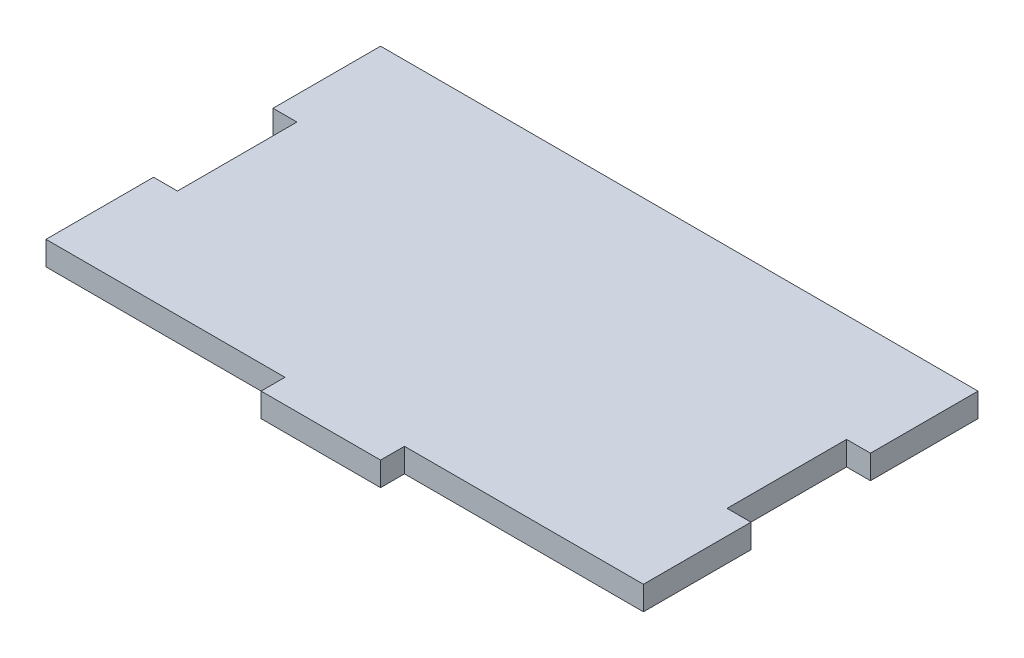
ISO-10303-21;
HEADER;
FILE_DESCRIPTION(('STEP AP214'),'2;1');
FILE_NAME('part.step','',(''),(''),'','','');
FILE_SCHEMA(('AUTOMOTIVE_DESIGN { 1 0 10303 214 1 1 1 1 }'));
ENDSEC;
DATA;
#1=APPLICATION_CONTEXT('core data for automotive mechanical design processes');
#2=APPLICATION_PROTOCOL_DEFINITION('international standard','automotive_design',2000,#1);
#3=PRODUCT_CONTEXT('',#1,'mechanical');
#4=PRODUCT('Part','Part','',(#3));
#5=PRODUCT_RELATED_PRODUCT_CATEGORY('part','',(#4));
#6=PRODUCT_DEFINITION_FORMATION('','',#4);
#7=PRODUCT_DEFINITION_CONTEXT('part definition',#1,'design');
#8=PRODUCT_DEFINITION('design','',#6,#7);
#9=PRODUCT_DEFINITION_SHAPE('','',#8);
#10=(LENGTH_UNIT() NAMED_UNIT(*) SI_UNIT(.MILLI.,.METRE.));
#11=(NAMED_UNIT(*) PLANE_ANGLE_UNIT() SI_UNIT($,.RADIAN.));
#12=(NAMED_UNIT(*) SI_UNIT($,.STERADIAN.) SOLID_ANGLE_UNIT());
#13=UNCERTAINTY_MEASURE_WITH_UNIT(LENGTH_MEASURE(1.E-05),#10,'distance_accuracy_value','');
#14=(GEOMETRIC_REPRESENTATION_CONTEXT(3) GLOBAL_UNCERTAINTY_ASSIGNED_CONTEXT((#13)) GLOBAL_UNIT_ASSIGNED_CONTEXT((#10,
#11,#12)) REPRESENTATION_CONTEXT('',''));
#15=CARTESIAN_POINT('',(0.,0.,0.));
#16=DIRECTION('',(0.,0.,1.));
#17=DIRECTION('',(1.,0.,0.));
#18=AXIS2_PLACEMENT_3D('',#15,#16,#17);
#19=CARTESIAN_POINT('',(0.,4.,0.));
#20=DIRECTION('',(0.,0.,-1.));
#21=DIRECTION('',(-1.,0.,0.));
#22=AXIS2_PLACEMENT_3D('',#19,#20,#21);
#23=PLANE('',#22);
#24=DIRECTION('',(1.,0.,0.));
#25=VECTOR('',#24,1.);
#26=CARTESIAN_POINT('',(0.,0.,0.));
#27=LINE('',#26,#25);
#28=CARTESIAN_POINT('',(-4.,0.,0.));
#29=VERTEX_POINT('',#28);
#30=CARTESIAN_POINT('',(36.,0.,0.));
#31=VERTEX_POINT('',#30);
#32=EDGE_CURVE('E181',#29,#31,#27,.T.);
#33=ORIENTED_EDGE('',*,*,#32,.T.);
#34=DIRECTION('',(0.,-1.,0.));
#35=VECTOR('',#34,1.);
#36=CARTESIAN_POINT('',(36.,4.,0.));
#37=LINE('',#36,#35);
#38=CARTESIAN_POINT('',(36.,4.,0.));
#39=VERTEX_POINT('',#38);
#40=EDGE_CURVE('E11',#39,#31,#37,.T.);
#41=ORIENTED_EDGE('',*,*,#40,.F.);
#42=DIRECTION('',(1.,0.,0.));
#43=VECTOR('',#42,1.);
#44=CARTESIAN_POINT('',(0.,4.,0.));
#45=LINE('',#44,#43);
#46=CARTESIAN_POINT('',(-4.,4.,0.));
#47=VERTEX_POINT('',#46);
#48=EDGE_CURVE('E221',#47,#39,#45,.T.);
#49=ORIENTED_EDGE('',*,*,#48,.F.);
#50=DIRECTION('',(0.,-1.,0.));
#51=VECTOR('',#50,1.);
#52=CARTESIAN_POINT('',(-4.,4.,0.));
#53=LINE('',#52,#51);
#54=EDGE_CURVE('E180',#47,#29,#53,.T.);
#55=ORIENTED_EDGE('',*,*,#54,.T.);
#56=EDGE_LOOP('',(#33,#41,#49,#55));
#57=FACE_BOUND('',#56,.T.);
#58=ADVANCED_FACE('F36',(#57),#23,.F.);
#59=CARTESIAN_POINT('',(36.,4.,0.));
#60=DIRECTION('',(1.,0.,0.));
#61=DIRECTION('',(0.,0.,-1.));
#62=AXIS2_PLACEMENT_3D('',#59,#60,#61);
#63=PLANE('',#62);
#64=DIRECTION('',(0.,0.,1.));
#65=VECTOR('',#64,1.);
#66=CARTESIAN_POINT('',(36.,0.,0.));
#67=LINE('',#66,#65);
#68=CARTESIAN_POINT('',(36.,0.,4.));
#69=VERTEX_POINT('',#68);
#70=EDGE_CURVE('E184',#31,#69,#67,.T.);
#71=ORIENTED_EDGE('',*,*,#70,.T.);
#72=DIRECTION('',(0.,-1.,0.));
#73=VECTOR('',#72,1.);
#74=CARTESIAN_POINT('',(36.,4.,4.));
#75=LINE('',#74,#73);
#76=CARTESIAN_POINT('',(36.,4.,4.));
#77=VERTEX_POINT('',#76);
#78=EDGE_CURVE('E44',#77,#69,#75,.T.);
#79=ORIENTED_EDGE('',*,*,#78,.F.);
#80=DIRECTION('',(0.,0.,1.));
#81=VECTOR('',#80,1.);
#82=CARTESIAN_POINT('',(36.,4.,0.));
#83=LINE('',#82,#81);
#84=EDGE_CURVE('E118',#39,#77,#83,.T.);
#85=ORIENTED_EDGE('',*,*,#84,.F.);
#86=ORIENTED_EDGE('',*,*,#40,.T.);
#87=EDGE_LOOP('',(#71,#79,#85,#86));
#88=FACE_BOUND('',#87,.T.);
#89=ADVANCED_FACE('F308',(#88),#63,.F.);
#90=CARTESIAN_POINT('',(0.,4.,4.));
#91=DIRECTION('',(0.,0.,-1.));
#92=DIRECTION('',(-1.,0.,0.));
#93=AXIS2_PLACEMENT_3D('',#90,#91,#92);
#94=PLANE('',#93);
#95=DIRECTION('',(1.,0.,0.));
#96=VECTOR('',#95,1.);
#97=CARTESIAN_POINT('',(0.,0.,4.));
#98=LINE('',#97,#96);
#99=CARTESIAN_POINT('',(56.,0.,4.));
#100=VERTEX_POINT('',#99);
#101=EDGE_CURVE('E186',#69,#100,#98,.T.);
#102=ORIENTED_EDGE('',*,*,#101,.T.);
#103=DIRECTION('',(0.,-1.,0.));
#104=VECTOR('',#103,1.);
#105=CARTESIAN_POINT('',(56.,4.,4.));
#106=LINE('',#105,#104);
#107=CARTESIAN_POINT('',(56.,4.,4.));
#108=VERTEX_POINT('',#107);
#109=EDGE_CURVE('E244',#108,#100,#106,.T.);
#110=ORIENTED_EDGE('',*,*,#109,.F.);
#111=DIRECTION('',(1.,0.,0.));
#112=VECTOR('',#111,1.);
#113=CARTESIAN_POINT('',(0.,4.,4.));
#114=LINE('',#113,#112);
#115=EDGE_CURVE('E251',#77,#108,#114,.T.);
#116=ORIENTED_EDGE('',*,*,#115,.F.);
#117=ORIENTED_EDGE('',*,*,#78,.T.);
#118=EDGE_LOOP('',(#102,#110,#116,#117));
#119=FACE_BOUND('',#118,.T.);
#120=ADVANCED_FACE('F249',(#119),#94,.F.);
#121=CARTESIAN_POINT('',(56.,4.,0.));
#122=DIRECTION('',(1.,0.,0.));
#123=DIRECTION('',(0.,0.,-1.));
#124=AXIS2_PLACEMENT_3D('',#121,#122,#123);
#125=PLANE('',#124);
#126=DIRECTION('',(0.,0.,1.));
#127=VECTOR('',#126,1.);
#128=CARTESIAN_POINT('',(56.,0.,0.));
#129=LINE('',#128,#127);
#130=CARTESIAN_POINT('',(56.,0.,0.));
#131=VERTEX_POINT('',#130);
#132=EDGE_CURVE('E189',#131,#100,#129,.T.);
#133=ORIENTED_EDGE('',*,*,#132,.F.);
#134=DIRECTION('',(0.,-1.,0.));
#135=VECTOR('',#134,1.);
#136=CARTESIAN_POINT('',(56.,4.,0.));
#137=LINE('',#136,#135);
#138=CARTESIAN_POINT('',(56.,4.,0.));
#139=VERTEX_POINT('',#138);
#140=EDGE_CURVE('E242',#139,#131,#137,.T.);
#141=ORIENTED_EDGE('',*,*,#140,.F.);
#142=DIRECTION('',(0.,0.,1.));
#143=VECTOR('',#142,1.);
#144=CARTESIAN_POINT('',(56.,4.,0.));
#145=LINE('',#144,#143);
#146=EDGE_CURVE('E262',#139,#108,#145,.T.);
#147=ORIENTED_EDGE('',*,*,#146,.T.);
#148=ORIENTED_EDGE('',*,*,#109,.T.);
#149=EDGE_LOOP('',(#133,#141,#147,#148));
#150=FACE_BOUND('',#149,.T.);
#151=ADVANCED_FACE('F258',(#150),#125,.T.);
#152=CARTESIAN_POINT('',(0.,4.,0.));
#153=DIRECTION('',(0.,0.,-1.));
#154=DIRECTION('',(-1.,0.,0.));
#155=AXIS2_PLACEMENT_3D('',#152,#153,#154);
#156=PLANE('',#155);
#157=DIRECTION('',(1.,0.,0.));
#158=VECTOR('',#157,1.);
#159=CARTESIAN_POINT('',(0.,0.,0.));
#160=LINE('',#159,#158);
#161=CARTESIAN_POINT('',(96.,0.,0.));
#162=VERTEX_POINT('',#161);
#163=EDGE_CURVE('E192',#131,#162,#160,.T.);
#164=ORIENTED_EDGE('',*,*,#163,.T.);
#165=DIRECTION('',(0.,-1.,0.));
#166=VECTOR('',#165,1.);
#167=CARTESIAN_POINT('',(96.,4.,0.));
#168=LINE('',#167,#166);
#169=CARTESIAN_POINT('',(96.,4.,0.));
#170=VERTEX_POINT('',#169);
#171=EDGE_CURVE('E240',#170,#162,#168,.T.);
#172=ORIENTED_EDGE('',*,*,#171,.F.);
#173=DIRECTION('',(1.,0.,0.));
#174=VECTOR('',#173,1.);
#175=CARTESIAN_POINT('',(0.,4.,0.));
#176=LINE('',#175,#174);
#177=EDGE_CURVE('E263',#139,#170,#176,.T.);
#178=ORIENTED_EDGE('',*,*,#177,.F.);
#179=ORIENTED_EDGE('',*,*,#140,.T.);
#180=EDGE_LOOP('',(#164,#172,#178,#179));
#181=FACE_BOUND('',#180,.T.);
#182=ADVANCED_FACE('F319',(#181),#156,.F.);
#183=CARTESIAN_POINT('',(96.,4.,0.));
#184=DIRECTION('',(1.,0.,0.));
#185=DIRECTION('',(0.,0.,-1.));
#186=AXIS2_PLACEMENT_3D('',#183,#184,#185);
#187=PLANE('',#186);
#188=DIRECTION('',(0.,0.,1.));
#189=VECTOR('',#188,1.);
#190=CARTESIAN_POINT('',(96.,0.,0.));
#191=LINE('',#190,#189);
#192=CARTESIAN_POINT('',(96.,0.,-18.));
#193=VERTEX_POINT('',#192);
#194=EDGE_CURVE('E195',#193,#162,#191,.T.);
#195=ORIENTED_EDGE('',*,*,#194,.F.);
#196=DIRECTION('',(0.,-1.,0.));
#197=VECTOR('',#196,1.);
#198=CARTESIAN_POINT('',(96.,4.,-18.));
#199=LINE('',#198,#197);
#200=CARTESIAN_POINT('',(96.,4.,-18.));
#201=VERTEX_POINT('',#200);
#202=EDGE_CURVE('E238',#201,#193,#199,.T.);
#203=ORIENTED_EDGE('',*,*,#202,.F.);
#204=DIRECTION('',(0.,0.,1.));
#205=VECTOR('',#204,1.);
#206=CARTESIAN_POINT('',(96.,4.,0.));
#207=LINE('',#206,#205);
#208=EDGE_CURVE('E265',#201,#170,#207,.T.);
#209=ORIENTED_EDGE('',*,*,#208,.T.);
#210=ORIENTED_EDGE('',*,*,#171,.T.);
#211=EDGE_LOOP('',(#195,#203,#209,#210));
#212=FACE_BOUND('',#211,.T.);
#213=ADVANCED_FACE('F322',(#212),#187,.T.);
#214=CARTESIAN_POINT('',(0.,4.,-18.));
#215=DIRECTION('',(0.,0.,-1.));
#216=DIRECTION('',(-1.,0.,0.));
#217=AXIS2_PLACEMENT_3D('',#214,#215,#216);
#218=PLANE('',#217);
#219=DIRECTION('',(1.,0.,0.));
#220=VECTOR('',#219,1.);
#221=CARTESIAN_POINT('',(0.,0.,-18.));
#222=LINE('',#221,#220);
#223=CARTESIAN_POINT('',(92.,0.,-18.));
#224=VERTEX_POINT('',#223);
#225=EDGE_CURVE('E198',#224,#193,#222,.T.);
#226=ORIENTED_EDGE('',*,*,#225,.F.);
#227=DIRECTION('',(0.,-1.,0.));
#228=VECTOR('',#227,1.);
#229=CARTESIAN_POINT('',(92.,4.,-18.));
#230=LINE('',#229,#228);
#231=CARTESIAN_POINT('',(92.,4.,-18.));
#232=VERTEX_POINT('',#231);
#233=EDGE_CURVE('E236',#232,#224,#230,.T.);
#234=ORIENTED_EDGE('',*,*,#233,.F.);
#235=DIRECTION('',(1.,0.,0.));
#236=VECTOR('',#235,1.);
#237=CARTESIAN_POINT('',(0.,4.,-18.));
#238=LINE('',#237,#236);
#239=EDGE_CURVE('E272',#232,#201,#238,.T.);
#240=ORIENTED_EDGE('',*,*,#239,.T.);
#241=ORIENTED_EDGE('',*,*,#202,.T.);
#242=EDGE_LOOP('',(#226,#234,#240,#241));
#243=FACE_BOUND('',#242,.T.);
#244=ADVANCED_FACE('F326',(#243),#218,.T.);
#245=CARTESIAN_POINT('',(92.,4.,0.));
#246=DIRECTION('',(-1.,0.,0.));
#247=DIRECTION('',(0.,0.,1.));
#248=AXIS2_PLACEMENT_3D('',#245,#246,#247);
#249=PLANE('',#248);
#250=DIRECTION('',(0.,0.,-1.));
#251=VECTOR('',#250,1.);
#252=CARTESIAN_POINT('',(92.,0.,0.));
#253=LINE('',#252,#251);
#254=CARTESIAN_POINT('',(92.,0.,-38.));
#255=VERTEX_POINT('',#254);
#256=EDGE_CURVE('E201',#224,#255,#253,.T.);
#257=ORIENTED_EDGE('',*,*,#256,.T.);
#258=DIRECTION('',(0.,-1.,0.));
#259=VECTOR('',#258,1.);
#260=CARTESIAN_POINT('',(92.,4.,-38.));
#261=LINE('',#260,#259);
#262=CARTESIAN_POINT('',(92.,4.,-38.));
#263=VERTEX_POINT('',#262);
#264=EDGE_CURVE('E233',#263,#255,#261,.T.);
#265=ORIENTED_EDGE('',*,*,#264,.F.);
#266=DIRECTION('',(0.,0.,-1.));
#267=VECTOR('',#266,1.);
#268=CARTESIAN_POINT('',(92.,4.,0.));
#269=LINE('',#268,#267);
#270=EDGE_CURVE('E275',#232,#263,#269,.T.);
#271=ORIENTED_EDGE('',*,*,#270,.F.);
#272=ORIENTED_EDGE('',*,*,#233,.T.);
#273=EDGE_LOOP('',(#257,#265,#271,#272));
#274=FACE_BOUND('',#273,.T.);
#275=ADVANCED_FACE('F330',(#274),#249,.F.);
#276=CARTESIAN_POINT('',(0.,4.,-38.));
#277=DIRECTION('',(0.,0.,-1.));
#278=DIRECTION('',(-1.,0.,0.));
#279=AXIS2_PLACEMENT_3D('',#276,#277,#278);
#280=PLANE('',#279);
#281=DIRECTION('',(1.,0.,0.));
#282=VECTOR('',#281,1.);
#283=CARTESIAN_POINT('',(0.,0.,-38.));
#284=LINE('',#283,#282);
#285=CARTESIAN_POINT('',(96.,0.,-38.));
#286=VERTEX_POINT('',#285);
#287=EDGE_CURVE('E203',#255,#286,#284,.T.);
#288=ORIENTED_EDGE('',*,*,#287,.T.);
#289=DIRECTION('',(0.,-1.,0.));
#290=VECTOR('',#289,1.);
#291=CARTESIAN_POINT('',(96.,4.,-38.));
#292=LINE('',#291,#290);
#293=CARTESIAN_POINT('',(96.,4.,-38.));
#294=VERTEX_POINT('',#293);
#295=EDGE_CURVE('E231',#294,#286,#292,.T.);
#296=ORIENTED_EDGE('',*,*,#295,.F.);
#297=DIRECTION('',(1.,0.,0.));
#298=VECTOR('',#297,1.);
#299=CARTESIAN_POINT('',(0.,4.,-38.));
#300=LINE('',#299,#298);
#301=EDGE_CURVE('E277',#263,#294,#300,.T.);
#302=ORIENTED_EDGE('',*,*,#301,.F.);
#303=ORIENTED_EDGE('',*,*,#264,.T.);
#304=EDGE_LOOP('',(#288,#296,#302,#303));
#305=FACE_BOUND('',#304,.T.);
#306=ADVANCED_FACE('F334',(#305),#280,.F.);
#307=CARTESIAN_POINT('',(96.,4.,0.));
#308=DIRECTION('',(1.,0.,0.));
#309=DIRECTION('',(0.,0.,-1.));
#310=AXIS2_PLACEMENT_3D('',#307,#308,#309);
#311=PLANE('',#310);
#312=DIRECTION('',(0.,0.,1.));
#313=VECTOR('',#312,1.);
#314=CARTESIAN_POINT('',(96.,0.,0.));
#315=LINE('',#314,#313);
#316=CARTESIAN_POINT('',(96.,0.,-56.));
#317=VERTEX_POINT('',#316);
#318=EDGE_CURVE('E206',#317,#286,#315,.T.);
#319=ORIENTED_EDGE('',*,*,#318,.F.);
#320=DIRECTION('',(0.,-1.,0.));
#321=VECTOR('',#320,1.);
#322=CARTESIAN_POINT('',(96.,4.,-56.));
#323=LINE('',#322,#321);
#324=CARTESIAN_POINT('',(96.,4.,-56.));
#325=VERTEX_POINT('',#324);
#326=EDGE_CURVE('E229',#325,#317,#323,.T.);
#327=ORIENTED_EDGE('',*,*,#326,.F.);
#328=DIRECTION('',(0.,0.,1.));
#329=VECTOR('',#328,1.);
#330=CARTESIAN_POINT('',(96.,4.,0.));
#331=LINE('',#330,#329);
#332=EDGE_CURVE('E279',#325,#294,#331,.T.);
#333=ORIENTED_EDGE('',*,*,#332,.T.);
#334=ORIENTED_EDGE('',*,*,#295,.T.);
#335=EDGE_LOOP('',(#319,#327,#333,#334));
#336=FACE_BOUND('',#335,.T.);
#337=ADVANCED_FACE('F338',(#336),#311,.T.);
#338=CARTESIAN_POINT('',(0.,4.,-56.));
#339=DIRECTION('',(0.,0.,-1.));
#340=DIRECTION('',(-1.,0.,0.));
#341=AXIS2_PLACEMENT_3D('',#338,#339,#340);
#342=PLANE('',#341);
#343=DIRECTION('',(1.,0.,0.));
#344=VECTOR('',#343,1.);
#345=CARTESIAN_POINT('',(0.,0.,-56.));
#346=LINE('',#345,#344);
#347=CARTESIAN_POINT('',(-4.,0.,-56.));
#348=VERTEX_POINT('',#347);
#349=EDGE_CURVE('E209',#348,#317,#346,.T.);
#350=ORIENTED_EDGE('',*,*,#349,.F.);
#351=DIRECTION('',(0.,-1.,0.));
#352=VECTOR('',#351,1.);
#353=CARTESIAN_POINT('',(-4.,4.,-56.));
#354=LINE('',#353,#352);
#355=CARTESIAN_POINT('',(-4.,4.,-56.));
#356=VERTEX_POINT('',#355);
#357=EDGE_CURVE('E227',#356,#348,#354,.T.);
#358=ORIENTED_EDGE('',*,*,#357,.F.);
#359=DIRECTION('',(1.,0.,0.));
#360=VECTOR('',#359,1.);
#361=CARTESIAN_POINT('',(0.,4.,-56.));
#362=LINE('',#361,#360);
#363=EDGE_CURVE('E282',#356,#325,#362,.T.);
#364=ORIENTED_EDGE('',*,*,#363,.T.);
#365=ORIENTED_EDGE('',*,*,#326,.T.);
#366=EDGE_LOOP('',(#350,#358,#364,#365));
#367=FACE_BOUND('',#366,.T.);
#368=ADVANCED_FACE('F342',(#367),#342,.T.);
#369=CARTESIAN_POINT('',(-3.99999999999999,4.,0.));
#370=DIRECTION('',(1.,0.,0.));
#371=DIRECTION('',(0.,0.,-1.));
#372=AXIS2_PLACEMENT_3D('',#369,#370,#371);
#373=PLANE('',#372);
#374=DIRECTION('',(0.,0.,1.));
#375=VECTOR('',#374,1.);
#376=CARTESIAN_POINT('',(-3.99999999999999,0.,0.));
#377=LINE('',#376,#375);
#378=CARTESIAN_POINT('',(-4.,0.,-38.));
#379=VERTEX_POINT('',#378);
#380=EDGE_CURVE('E212',#348,#379,#377,.T.);
#381=ORIENTED_EDGE('',*,*,#380,.T.);
#382=DIRECTION('',(0.,-1.,0.));
#383=VECTOR('',#382,1.);
#384=CARTESIAN_POINT('',(-4.,4.,-38.));
#385=LINE('',#384,#383);
#386=CARTESIAN_POINT('',(-4.,4.,-38.));
#387=VERTEX_POINT('',#386);
#388=EDGE_CURVE('E225',#387,#379,#385,.T.);
#389=ORIENTED_EDGE('',*,*,#388,.F.);
#390=DIRECTION('',(0.,0.,1.));
#391=VECTOR('',#390,1.);
#392=CARTESIAN_POINT('',(-3.99999999999999,4.,0.));
#393=LINE('',#392,#391);
#394=EDGE_CURVE('E175',#356,#387,#393,.T.);
#395=ORIENTED_EDGE('',*,*,#394,.F.);
#396=ORIENTED_EDGE('',*,*,#357,.T.);
#397=EDGE_LOOP('',(#381,#389,#395,#396));
#398=FACE_BOUND('',#397,.T.);
#399=ADVANCED_FACE('F289',(#398),#373,.F.);
#400=CARTESIAN_POINT('',(0.,4.,-38.));
#401=DIRECTION('',(0.,0.,1.));
#402=DIRECTION('',(1.,0.,0.));
#403=AXIS2_PLACEMENT_3D('',#400,#401,#402);
#404=PLANE('',#403);
#405=DIRECTION('',(-1.,0.,0.));
#406=VECTOR('',#405,1.);
#407=CARTESIAN_POINT('',(0.,0.,-38.));
#408=LINE('',#407,#406);
#409=CARTESIAN_POINT('',(0.,0.,-38.));
#410=VERTEX_POINT('',#409);
#411=EDGE_CURVE('E215',#410,#379,#408,.T.);
#412=ORIENTED_EDGE('',*,*,#411,.F.);
#413=DIRECTION('',(0.,-1.,0.));
#414=VECTOR('',#413,1.);
#415=CARTESIAN_POINT('',(0.,4.,-38.));
#416=LINE('',#415,#414);
#417=CARTESIAN_POINT('',(0.,4.,-38.));
#418=VERTEX_POINT('',#417);
#419=EDGE_CURVE('E164',#418,#410,#416,.T.);
#420=ORIENTED_EDGE('',*,*,#419,.F.);
#421=DIRECTION('',(-1.,0.,0.));
#422=VECTOR('',#421,1.);
#423=CARTESIAN_POINT('',(0.,4.,-38.));
#424=LINE('',#423,#422);
#425=EDGE_CURVE('E173',#418,#387,#424,.T.);
#426=ORIENTED_EDGE('',*,*,#425,.T.);
#427=ORIENTED_EDGE('',*,*,#388,.T.);
#428=EDGE_LOOP('',(#412,#420,#426,#427));
#429=FACE_BOUND('',#428,.T.);
#430=ADVANCED_FACE('F293',(#429),#404,.T.);
#431=CARTESIAN_POINT('',(0.,4.,0.));
#432=DIRECTION('',(-1.,0.,0.));
#433=DIRECTION('',(0.,0.,1.));
#434=AXIS2_PLACEMENT_3D('',#431,#432,#433);
#435=PLANE('',#434);
#436=DIRECTION('',(0.,0.,-1.));
#437=VECTOR('',#436,1.);
#438=CARTESIAN_POINT('',(0.,0.,0.));
#439=LINE('',#438,#437);
#440=CARTESIAN_POINT('',(0.,0.,-18.));
#441=VERTEX_POINT('',#440);
#442=EDGE_CURVE('E163',#441,#410,#439,.T.);
#443=ORIENTED_EDGE('',*,*,#442,.F.);
#444=DIRECTION('',(0.,-1.,0.));
#445=VECTOR('',#444,1.);
#446=CARTESIAN_POINT('',(0.,4.,-18.));
#447=LINE('',#446,#445);
#448=CARTESIAN_POINT('',(0.,4.,-18.));
#449=VERTEX_POINT('',#448);
#450=EDGE_CURVE('E157',#449,#441,#447,.T.);
#451=ORIENTED_EDGE('',*,*,#450,.F.);
#452=DIRECTION('',(0.,0.,-1.));
#453=VECTOR('',#452,1.);
#454=CARTESIAN_POINT('',(0.,4.,0.));
#455=LINE('',#454,#453);
#456=EDGE_CURVE('E161',#449,#418,#455,.T.);
#457=ORIENTED_EDGE('',*,*,#456,.T.);
#458=ORIENTED_EDGE('',*,*,#419,.T.);
#459=EDGE_LOOP('',(#443,#451,#457,#458));
#460=FACE_BOUND('',#459,.T.);
#461=ADVANCED_FACE('F159',(#460),#435,.T.);
#462=CARTESIAN_POINT('',(0.,4.,-18.));
#463=DIRECTION('',(0.,0.,1.));
#464=DIRECTION('',(1.,0.,0.));
#465=AXIS2_PLACEMENT_3D('',#462,#463,#464);
#466=PLANE('',#465);
#467=DIRECTION('',(-1.,0.,0.));
#468=VECTOR('',#467,1.);
#469=CARTESIAN_POINT('',(0.,0.,-18.));
#470=LINE('',#469,#468);
#471=CARTESIAN_POINT('',(-4.,0.,-18.));
#472=VERTEX_POINT('',#471);
#473=EDGE_CURVE('E104',#441,#472,#470,.T.);
#474=ORIENTED_EDGE('',*,*,#473,.T.);
#475=DIRECTION('',(0.,-1.,0.));
#476=VECTOR('',#475,1.);
#477=CARTESIAN_POINT('',(-4.,4.,-18.));
#478=LINE('',#477,#476);
#479=CARTESIAN_POINT('',(-4.,4.,-18.));
#480=VERTEX_POINT('',#479);
#481=EDGE_CURVE('E165',#480,#472,#478,.T.);
#482=ORIENTED_EDGE('',*,*,#481,.F.);
#483=DIRECTION('',(-1.,0.,0.));
#484=VECTOR('',#483,1.);
#485=CARTESIAN_POINT('',(0.,4.,-18.));
#486=LINE('',#485,#484);
#487=EDGE_CURVE('E167',#449,#480,#486,.T.);
#488=ORIENTED_EDGE('',*,*,#487,.F.);
#489=ORIENTED_EDGE('',*,*,#450,.T.);
#490=EDGE_LOOP('',(#474,#482,#488,#489));
#491=FACE_BOUND('',#490,.T.);
#492=ADVANCED_FACE('F168',(#491),#466,.F.);
#493=CARTESIAN_POINT('',(-4.,4.,0.));
#494=DIRECTION('',(1.,0.,0.));
#495=DIRECTION('',(0.,0.,-1.));
#496=AXIS2_PLACEMENT_3D('',#493,#494,#495);
#497=PLANE('',#496);
#498=DIRECTION('',(0.,0.,1.));
#499=VECTOR('',#498,1.);
#500=CARTESIAN_POINT('',(-4.,0.,0.));
#501=LINE('',#500,#499);
#502=EDGE_CURVE('E110',#472,#29,#501,.T.);
#503=ORIENTED_EDGE('',*,*,#502,.T.);
#504=ORIENTED_EDGE('',*,*,#54,.F.);
#505=DIRECTION('',(0.,0.,1.));
#506=VECTOR('',#505,1.);
#507=CARTESIAN_POINT('',(-4.,4.,0.));
#508=LINE('',#507,#506);
#509=EDGE_CURVE('E52',#480,#47,#508,.T.);
#510=ORIENTED_EDGE('',*,*,#509,.F.);
#511=ORIENTED_EDGE('',*,*,#481,.T.);
#512=EDGE_LOOP('',(#503,#504,#510,#511));
#513=FACE_BOUND('',#512,.T.);
#514=ADVANCED_FACE('F297',(#513),#497,.F.);
#515=CARTESIAN_POINT('',(0.,4.,0.));
#516=DIRECTION('',(0.,1.,0.));
#517=DIRECTION('',(0.,0.,1.));
#518=AXIS2_PLACEMENT_3D('',#515,#516,#517);
#519=PLANE('',#518);
#520=ORIENTED_EDGE('',*,*,#48,.T.);
#521=ORIENTED_EDGE('',*,*,#84,.T.);
#522=ORIENTED_EDGE('',*,*,#115,.T.);
#523=ORIENTED_EDGE('',*,*,#146,.F.);
#524=ORIENTED_EDGE('',*,*,#177,.T.);
#525=ORIENTED_EDGE('',*,*,#208,.F.);
#526=ORIENTED_EDGE('',*,*,#239,.F.);
#527=ORIENTED_EDGE('',*,*,#270,.T.);
#528=ORIENTED_EDGE('',*,*,#301,.T.);
#529=ORIENTED_EDGE('',*,*,#332,.F.);
#530=ORIENTED_EDGE('',*,*,#363,.F.);
#531=ORIENTED_EDGE('',*,*,#394,.T.);
#532=ORIENTED_EDGE('',*,*,#425,.F.);
#533=ORIENTED_EDGE('',*,*,#456,.F.);
#534=ORIENTED_EDGE('',*,*,#487,.T.);
#535=ORIENTED_EDGE('',*,*,#509,.T.);
#536=EDGE_LOOP('',(#520,#521,#522,#523,#524,#525,#526,#527,#528,#529,#530,#531,#532,#533,#534,#535));
#537=FACE_BOUND('',#536,.T.);
#538=ADVANCED_FACE('F171',(#537),#519,.T.);
#539=CARTESIAN_POINT('',(0.,0.,0.));
#540=DIRECTION('',(0.,1.,0.));
#541=DIRECTION('',(0.,0.,1.));
#542=AXIS2_PLACEMENT_3D('',#539,#540,#541);
#543=PLANE('',#542);
#544=ORIENTED_EDGE('',*,*,#32,.F.);
#545=ORIENTED_EDGE('',*,*,#502,.F.);
#546=ORIENTED_EDGE('',*,*,#473,.F.);
#547=ORIENTED_EDGE('',*,*,#442,.T.);
#548=ORIENTED_EDGE('',*,*,#411,.T.);
#549=ORIENTED_EDGE('',*,*,#380,.F.);
#550=ORIENTED_EDGE('',*,*,#349,.T.);
#551=ORIENTED_EDGE('',*,*,#318,.T.);
#552=ORIENTED_EDGE('',*,*,#287,.F.);
#553=ORIENTED_EDGE('',*,*,#256,.F.);
#554=ORIENTED_EDGE('',*,*,#225,.T.);
#555=ORIENTED_EDGE('',*,*,#194,.T.);
#556=ORIENTED_EDGE('',*,*,#163,.F.);
#557=ORIENTED_EDGE('',*,*,#132,.T.);
#558=ORIENTED_EDGE('',*,*,#101,.F.);
#559=ORIENTED_EDGE('',*,*,#70,.F.);
#560=EDGE_LOOP('',(#544,#545,#546,#547,#548,#549,#550,#551,#552,#553,#554,#555,#556,#557,#558,#559));
#561=FACE_BOUND('',#560,.T.);
#562=ADVANCED_FACE('F254',(#561),#543,.F.);
#563=CLOSED_SHELL('',(#58,#89,#120,#151,#182,#213,#244,#275,#306,#337,#368,#399,#430,#461,#492,
#514,#538,#562));
#564=MANIFOLD_SOLID_BREP('B2',#563);
#565=ADVANCED_BREP_SHAPE_REPRESENTATION('',(#18,#564),#14);
#566=SHAPE_DEFINITION_REPRESENTATION(#9,#565);
ENDSEC;
END-ISO-10303-21;
